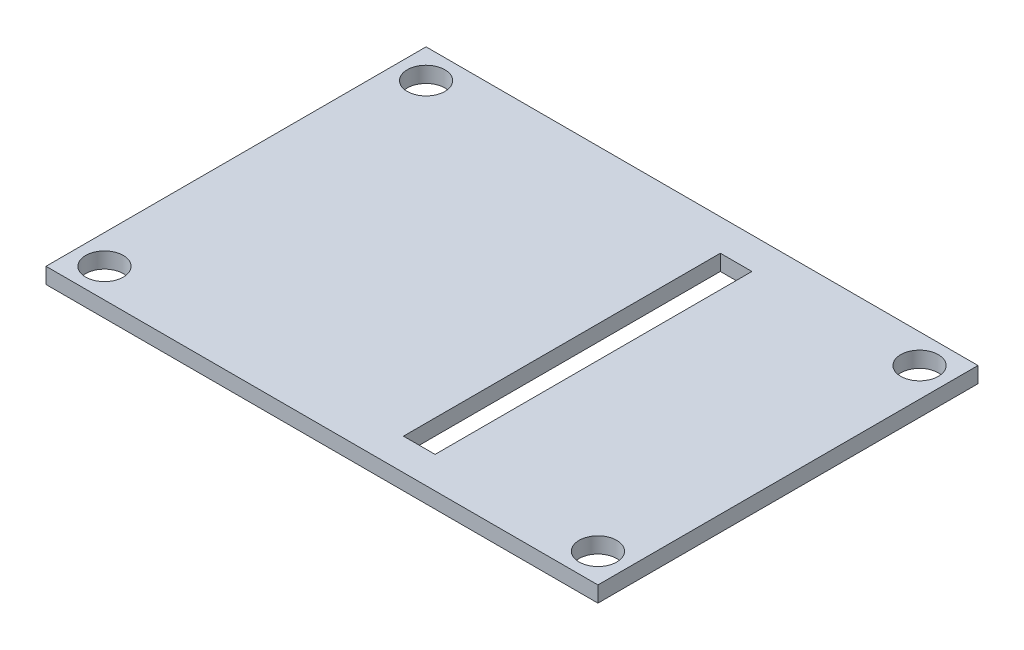
ISO-10303-21;
HEADER;
FILE_DESCRIPTION(('STEP AP214'),'2;1');
FILE_NAME('part.step','',(''),(''),'','','');
FILE_SCHEMA(('AUTOMOTIVE_DESIGN { 1 0 10303 214 1 1 1 1 }'));
ENDSEC;
DATA;
#1=APPLICATION_CONTEXT('core data for automotive mechanical design processes');
#2=APPLICATION_PROTOCOL_DEFINITION('international standard','automotive_design',2000,#1);
#3=PRODUCT_CONTEXT('',#1,'mechanical');
#4=PRODUCT('Part','Part','',(#3));
#5=PRODUCT_RELATED_PRODUCT_CATEGORY('part','',(#4));
#6=PRODUCT_DEFINITION_FORMATION('','',#4);
#7=PRODUCT_DEFINITION_CONTEXT('part definition',#1,'design');
#8=PRODUCT_DEFINITION('design','',#6,#7);
#9=PRODUCT_DEFINITION_SHAPE('','',#8);
#10=(LENGTH_UNIT() NAMED_UNIT(*) SI_UNIT(.MILLI.,.METRE.));
#11=(NAMED_UNIT(*) PLANE_ANGLE_UNIT() SI_UNIT($,.RADIAN.));
#12=(NAMED_UNIT(*) SI_UNIT($,.STERADIAN.) SOLID_ANGLE_UNIT());
#13=UNCERTAINTY_MEASURE_WITH_UNIT(LENGTH_MEASURE(1.E-05),#10,'distance_accuracy_value','');
#14=(GEOMETRIC_REPRESENTATION_CONTEXT(3) GLOBAL_UNCERTAINTY_ASSIGNED_CONTEXT((#13)) GLOBAL_UNIT_ASSIGNED_CONTEXT((#10,
#11,#12)) REPRESENTATION_CONTEXT('',''));
#15=CARTESIAN_POINT('',(0.,0.,0.));
#16=DIRECTION('',(0.,0.,1.));
#17=DIRECTION('',(1.,0.,0.));
#18=AXIS2_PLACEMENT_3D('',#15,#16,#17);
#19=CARTESIAN_POINT('',(0.,2.,0.));
#20=DIRECTION('',(0.,1.,0.));
#21=DIRECTION('',(0.,0.,1.));
#22=AXIS2_PLACEMENT_3D('',#19,#20,#21);
#23=PLANE('',#22);
#24=CARTESIAN_POINT('',(31.9666125815743,2.,-11.2942221147107));
#25=DIRECTION('',(0.,1.,0.));
#26=DIRECTION('',(0.,0.,1.));
#27=AXIS2_PLACEMENT_3D('',#24,#25,#26);
#28=CIRCLE('',#27,2.38125);
#29=CARTESIAN_POINT('',(31.9666125815743,2.,-8.91297211471072));
#30=VERTEX_POINT('',#29);
#31=EDGE_CURVE('E240',#30,#30,#28,.T.);
#32=ORIENTED_EDGE('',*,*,#31,.F.);
#33=EDGE_LOOP('',(#32));
#34=FACE_BOUND('',#33,.T.);
#35=CARTESIAN_POINT('',(31.9666125815743,2.,29.4057778852893));
#36=DIRECTION('',(0.,1.,0.));
#37=DIRECTION('',(0.,0.,1.));
#38=AXIS2_PLACEMENT_3D('',#35,#36,#37);
#39=CIRCLE('',#38,2.38125);
#40=CARTESIAN_POINT('',(31.9666125815743,2.,31.7870278852893));
#41=VERTEX_POINT('',#40);
#42=EDGE_CURVE('E242',#41,#41,#39,.T.);
#43=ORIENTED_EDGE('',*,*,#42,.F.);
#44=EDGE_LOOP('',(#43));
#45=FACE_BOUND('',#44,.T.);
#46=CARTESIAN_POINT('',(-30.4833874184257,2.,-11.2942221147107));
#47=DIRECTION('',(0.,1.,0.));
#48=DIRECTION('',(0.,0.,1.));
#49=AXIS2_PLACEMENT_3D('',#46,#47,#48);
#50=CIRCLE('',#49,2.38125);
#51=CARTESIAN_POINT('',(-30.4833874184257,2.,-8.91297211471072));
#52=VERTEX_POINT('',#51);
#53=EDGE_CURVE('E248',#52,#52,#50,.T.);
#54=ORIENTED_EDGE('',*,*,#53,.F.);
#55=EDGE_LOOP('',(#54));
#56=FACE_BOUND('',#55,.T.);
#57=CARTESIAN_POINT('',(-30.4833874184257,2.,29.4057778852893));
#58=DIRECTION('',(0.,1.,0.));
#59=DIRECTION('',(0.,0.,1.));
#60=AXIS2_PLACEMENT_3D('',#57,#58,#59);
#61=CIRCLE('',#60,2.38125);
#62=CARTESIAN_POINT('',(-30.4833874184257,2.,31.7870278852893));
#63=VERTEX_POINT('',#62);
#64=EDGE_CURVE('E254',#63,#63,#61,.T.);
#65=ORIENTED_EDGE('',*,*,#64,.F.);
#66=EDGE_LOOP('',(#65));
#67=FACE_BOUND('',#66,.T.);
#68=DIRECTION('',(0.,0.,1.));
#69=VECTOR('',#68,1.);
#70=CARTESIAN_POINT('',(-34.1833874184257,2.,-14.9942221147107));
#71=LINE('',#70,#69);
#72=CARTESIAN_POINT('',(-34.1833874184257,2.,-14.9942221147107));
#73=VERTEX_POINT('',#72);
#74=CARTESIAN_POINT('',(-34.1833874184257,2.,33.1057778852893));
#75=VERTEX_POINT('',#74);
#76=EDGE_CURVE('E138',#73,#75,#71,.T.);
#77=ORIENTED_EDGE('',*,*,#76,.T.);
#78=DIRECTION('',(1.,0.,0.));
#79=VECTOR('',#78,1.);
#80=CARTESIAN_POINT('',(-34.1833874184257,2.,33.1057778852893));
#81=LINE('',#80,#79);
#82=CARTESIAN_POINT('',(35.6666125815743,2.,33.1057778852893));
#83=VERTEX_POINT('',#82);
#84=EDGE_CURVE('E141',#75,#83,#81,.T.);
#85=ORIENTED_EDGE('',*,*,#84,.T.);
#86=DIRECTION('',(0.,0.,-1.));
#87=VECTOR('',#86,1.);
#88=CARTESIAN_POINT('',(35.6666125815743,2.,-14.9942221147107));
#89=LINE('',#88,#87);
#90=CARTESIAN_POINT('',(35.6666125815743,2.,-14.9942221147107));
#91=VERTEX_POINT('',#90);
#92=EDGE_CURVE('E144',#83,#91,#89,.T.);
#93=ORIENTED_EDGE('',*,*,#92,.T.);
#94=DIRECTION('',(-1.,0.,0.));
#95=VECTOR('',#94,1.);
#96=CARTESIAN_POINT('',(-34.1833874184257,2.,-14.9942221147107));
#97=LINE('',#96,#95);
#98=EDGE_CURVE('E146',#91,#73,#97,.T.);
#99=ORIENTED_EDGE('',*,*,#98,.T.);
#100=EDGE_LOOP('',(#77,#85,#93,#99));
#101=FACE_BOUND('',#100,.T.);
#102=DIRECTION('',(1.,0.,0.));
#103=VECTOR('',#102,1.);
#104=CARTESIAN_POINT('',(7.05661258157432,2.,29.1057778852893));
#105=LINE('',#104,#103);
#106=CARTESIAN_POINT('',(7.05661258157432,2.,29.1057778852893));
#107=VERTEX_POINT('',#106);
#108=CARTESIAN_POINT('',(11.0566125815743,2.,29.1057778852893));
#109=VERTEX_POINT('',#108);
#110=EDGE_CURVE('E108',#107,#109,#105,.T.);
#111=ORIENTED_EDGE('',*,*,#110,.F.);
#112=DIRECTION('',(0.,0.,1.));
#113=VECTOR('',#112,1.);
#114=CARTESIAN_POINT('',(7.05661258157431,2.,-10.9942221147107));
#115=LINE('',#114,#113);
#116=CARTESIAN_POINT('',(7.05661258157431,2.,-10.9942221147107));
#117=VERTEX_POINT('',#116);
#118=EDGE_CURVE('E100',#117,#107,#115,.T.);
#119=ORIENTED_EDGE('',*,*,#118,.F.);
#120=DIRECTION('',(-1.,0.,0.));
#121=VECTOR('',#120,1.);
#122=CARTESIAN_POINT('',(7.05661258157431,2.,-10.9942221147107));
#123=LINE('',#122,#121);
#124=CARTESIAN_POINT('',(11.0566125815743,2.,-10.9942221147107));
#125=VERTEX_POINT('',#124);
#126=EDGE_CURVE('E122',#125,#117,#123,.T.);
#127=ORIENTED_EDGE('',*,*,#126,.F.);
#128=DIRECTION('',(0.,0.,-1.));
#129=VECTOR('',#128,1.);
#130=CARTESIAN_POINT('',(11.0566125815743,2.,-10.9942221147107));
#131=LINE('',#130,#129);
#132=EDGE_CURVE('E120',#109,#125,#131,.T.);
#133=ORIENTED_EDGE('',*,*,#132,.F.);
#134=EDGE_LOOP('',(#111,#119,#127,#133));
#135=FACE_BOUND('',#134,.T.);
#136=ADVANCED_FACE('F35',(#34,#45,#56,#67,#101,#135),#23,.T.);
#137=CARTESIAN_POINT('',(0.,0.,0.));
#138=DIRECTION('',(0.,1.,0.));
#139=DIRECTION('',(0.,0.,1.));
#140=AXIS2_PLACEMENT_3D('',#137,#138,#139);
#141=PLANE('',#140);
#142=CARTESIAN_POINT('',(31.9666125815743,0.,-11.2942221147107));
#143=DIRECTION('',(0.,1.,0.));
#144=DIRECTION('',(0.,0.,1.));
#145=AXIS2_PLACEMENT_3D('',#142,#143,#144);
#146=CIRCLE('',#145,2.38125);
#147=CARTESIAN_POINT('',(31.9666125815743,0.,-8.91297211471072));
#148=VERTEX_POINT('',#147);
#149=EDGE_CURVE('E238',#148,#148,#146,.T.);
#150=ORIENTED_EDGE('',*,*,#149,.T.);
#151=EDGE_LOOP('',(#150));
#152=FACE_BOUND('',#151,.T.);
#153=CARTESIAN_POINT('',(31.9666125815743,0.,29.4057778852893));
#154=DIRECTION('',(0.,1.,0.));
#155=DIRECTION('',(0.,0.,1.));
#156=AXIS2_PLACEMENT_3D('',#153,#154,#155);
#157=CIRCLE('',#156,2.38125);
#158=CARTESIAN_POINT('',(31.9666125815743,0.,31.7870278852893));
#159=VERTEX_POINT('',#158);
#160=EDGE_CURVE('E245',#159,#159,#157,.T.);
#161=ORIENTED_EDGE('',*,*,#160,.T.);
#162=EDGE_LOOP('',(#161));
#163=FACE_BOUND('',#162,.T.);
#164=CARTESIAN_POINT('',(-30.4833874184257,0.,-11.2942221147107));
#165=DIRECTION('',(0.,1.,0.));
#166=DIRECTION('',(0.,0.,1.));
#167=AXIS2_PLACEMENT_3D('',#164,#165,#166);
#168=CIRCLE('',#167,2.38125);
#169=CARTESIAN_POINT('',(-30.4833874184257,0.,-8.91297211471072));
#170=VERTEX_POINT('',#169);
#171=EDGE_CURVE('E251',#170,#170,#168,.T.);
#172=ORIENTED_EDGE('',*,*,#171,.T.);
#173=EDGE_LOOP('',(#172));
#174=FACE_BOUND('',#173,.T.);
#175=CARTESIAN_POINT('',(-30.4833874184257,0.,29.4057778852893));
#176=DIRECTION('',(0.,1.,0.));
#177=DIRECTION('',(0.,0.,1.));
#178=AXIS2_PLACEMENT_3D('',#175,#176,#177);
#179=CIRCLE('',#178,2.38125);
#180=CARTESIAN_POINT('',(-30.4833874184257,0.,31.7870278852893));
#181=VERTEX_POINT('',#180);
#182=EDGE_CURVE('E128',#181,#181,#179,.T.);
#183=ORIENTED_EDGE('',*,*,#182,.T.);
#184=EDGE_LOOP('',(#183));
#185=FACE_BOUND('',#184,.T.);
#186=DIRECTION('',(0.,0.,1.));
#187=VECTOR('',#186,1.);
#188=CARTESIAN_POINT('',(-34.1833874184257,0.,-14.9942221147107));
#189=LINE('',#188,#187);
#190=CARTESIAN_POINT('',(-34.1833874184257,0.,-14.9942221147107));
#191=VERTEX_POINT('',#190);
#192=CARTESIAN_POINT('',(-34.1833874184257,0.,33.1057778852893));
#193=VERTEX_POINT('',#192);
#194=EDGE_CURVE('E116',#191,#193,#189,.T.);
#195=ORIENTED_EDGE('',*,*,#194,.F.);
#196=DIRECTION('',(-1.,0.,0.));
#197=VECTOR('',#196,1.);
#198=CARTESIAN_POINT('',(-34.1833874184257,0.,-14.9942221147107));
#199=LINE('',#198,#197);
#200=CARTESIAN_POINT('',(35.6666125815743,0.,-14.9942221147107));
#201=VERTEX_POINT('',#200);
#202=EDGE_CURVE('E142',#201,#191,#199,.T.);
#203=ORIENTED_EDGE('',*,*,#202,.F.);
#204=DIRECTION('',(0.,0.,-1.));
#205=VECTOR('',#204,1.);
#206=CARTESIAN_POINT('',(35.6666125815743,0.,-14.9942221147107));
#207=LINE('',#206,#205);
#208=CARTESIAN_POINT('',(35.6666125815743,0.,33.1057778852893));
#209=VERTEX_POINT('',#208);
#210=EDGE_CURVE('E153',#209,#201,#207,.T.);
#211=ORIENTED_EDGE('',*,*,#210,.F.);
#212=DIRECTION('',(1.,0.,0.));
#213=VECTOR('',#212,1.);
#214=CARTESIAN_POINT('',(-34.1833874184257,0.,33.1057778852893));
#215=LINE('',#214,#213);
#216=EDGE_CURVE('E151',#193,#209,#215,.T.);
#217=ORIENTED_EDGE('',*,*,#216,.F.);
#218=EDGE_LOOP('',(#195,#203,#211,#217));
#219=FACE_BOUND('',#218,.T.);
#220=DIRECTION('',(0.,0.,1.));
#221=VECTOR('',#220,1.);
#222=CARTESIAN_POINT('',(7.05661258157431,0.,-10.9942221147107));
#223=LINE('',#222,#221);
#224=CARTESIAN_POINT('',(7.05661258157431,0.,-10.9942221147107));
#225=VERTEX_POINT('',#224);
#226=CARTESIAN_POINT('',(7.05661258157432,0.,29.1057778852893));
#227=VERTEX_POINT('',#226);
#228=EDGE_CURVE('E58',#225,#227,#223,.T.);
#229=ORIENTED_EDGE('',*,*,#228,.T.);
#230=DIRECTION('',(1.,0.,0.));
#231=VECTOR('',#230,1.);
#232=CARTESIAN_POINT('',(7.05661258157432,0.,29.1057778852893));
#233=LINE('',#232,#231);
#234=CARTESIAN_POINT('',(11.0566125815743,0.,29.1057778852893));
#235=VERTEX_POINT('',#234);
#236=EDGE_CURVE('E115',#227,#235,#233,.T.);
#237=ORIENTED_EDGE('',*,*,#236,.T.);
#238=DIRECTION('',(0.,0.,-1.));
#239=VECTOR('',#238,1.);
#240=CARTESIAN_POINT('',(11.0566125815743,0.,-10.9942221147107));
#241=LINE('',#240,#239);
#242=CARTESIAN_POINT('',(11.0566125815743,0.,-10.9942221147107));
#243=VERTEX_POINT('',#242);
#244=EDGE_CURVE('E130',#235,#243,#241,.T.);
#245=ORIENTED_EDGE('',*,*,#244,.T.);
#246=DIRECTION('',(-1.,0.,0.));
#247=VECTOR('',#246,1.);
#248=CARTESIAN_POINT('',(7.05661258157431,0.,-10.9942221147107));
#249=LINE('',#248,#247);
#250=EDGE_CURVE('E109',#243,#225,#249,.T.);
#251=ORIENTED_EDGE('',*,*,#250,.T.);
#252=EDGE_LOOP('',(#229,#237,#245,#251));
#253=FACE_BOUND('',#252,.T.);
#254=ADVANCED_FACE('F171',(#152,#163,#174,#185,#219,#253),#141,.F.);
#255=CARTESIAN_POINT('',(-34.1833874184257,2.,-14.9942221147107));
#256=DIRECTION('',(1.,0.,0.));
#257=DIRECTION('',(0.,0.,-1.));
#258=AXIS2_PLACEMENT_3D('',#255,#256,#257);
#259=PLANE('',#258);
#260=ORIENTED_EDGE('',*,*,#194,.T.);
#261=DIRECTION('',(0.,-1.,0.));
#262=VECTOR('',#261,1.);
#263=CARTESIAN_POINT('',(-34.1833874184257,2.,33.1057778852893));
#264=LINE('',#263,#262);
#265=EDGE_CURVE('E11',#75,#193,#264,.T.);
#266=ORIENTED_EDGE('',*,*,#265,.F.);
#267=ORIENTED_EDGE('',*,*,#76,.F.);
#268=DIRECTION('',(0.,-1.,0.));
#269=VECTOR('',#268,1.);
#270=CARTESIAN_POINT('',(-34.1833874184257,2.,-14.9942221147107));
#271=LINE('',#270,#269);
#272=EDGE_CURVE('E148',#73,#191,#271,.T.);
#273=ORIENTED_EDGE('',*,*,#272,.T.);
#274=EDGE_LOOP('',(#260,#266,#267,#273));
#275=FACE_BOUND('',#274,.T.);
#276=ADVANCED_FACE('F37',(#275),#259,.F.);
#277=CARTESIAN_POINT('',(-34.1833874184257,2.,33.1057778852893));
#278=DIRECTION('',(0.,0.,-1.));
#279=DIRECTION('',(-1.,0.,0.));
#280=AXIS2_PLACEMENT_3D('',#277,#278,#279);
#281=PLANE('',#280);
#282=ORIENTED_EDGE('',*,*,#216,.T.);
#283=DIRECTION('',(0.,-1.,0.));
#284=VECTOR('',#283,1.);
#285=CARTESIAN_POINT('',(35.6666125815743,2.,33.1057778852893));
#286=LINE('',#285,#284);
#287=EDGE_CURVE('E43',#83,#209,#286,.T.);
#288=ORIENTED_EDGE('',*,*,#287,.F.);
#289=ORIENTED_EDGE('',*,*,#84,.F.);
#290=ORIENTED_EDGE('',*,*,#265,.T.);
#291=EDGE_LOOP('',(#282,#288,#289,#290));
#292=FACE_BOUND('',#291,.T.);
#293=ADVANCED_FACE('F181',(#292),#281,.F.);
#294=CARTESIAN_POINT('',(35.6666125815743,2.,-14.9942221147107));
#295=DIRECTION('',(-1.,0.,0.));
#296=DIRECTION('',(0.,0.,1.));
#297=AXIS2_PLACEMENT_3D('',#294,#295,#296);
#298=PLANE('',#297);
#299=ORIENTED_EDGE('',*,*,#210,.T.);
#300=DIRECTION('',(0.,-1.,0.));
#301=VECTOR('',#300,1.);
#302=CARTESIAN_POINT('',(35.6666125815743,2.,-14.9942221147107));
#303=LINE('',#302,#301);
#304=EDGE_CURVE('E158',#91,#201,#303,.T.);
#305=ORIENTED_EDGE('',*,*,#304,.F.);
#306=ORIENTED_EDGE('',*,*,#92,.F.);
#307=ORIENTED_EDGE('',*,*,#287,.T.);
#308=EDGE_LOOP('',(#299,#305,#306,#307));
#309=FACE_BOUND('',#308,.T.);
#310=ADVANCED_FACE('F165',(#309),#298,.F.);
#311=CARTESIAN_POINT('',(-34.1833874184257,2.,-14.9942221147107));
#312=DIRECTION('',(0.,0.,1.));
#313=DIRECTION('',(1.,0.,0.));
#314=AXIS2_PLACEMENT_3D('',#311,#312,#313);
#315=PLANE('',#314);
#316=ORIENTED_EDGE('',*,*,#202,.T.);
#317=ORIENTED_EDGE('',*,*,#272,.F.);
#318=ORIENTED_EDGE('',*,*,#98,.F.);
#319=ORIENTED_EDGE('',*,*,#304,.T.);
#320=EDGE_LOOP('',(#316,#317,#318,#319));
#321=FACE_BOUND('',#320,.T.);
#322=ADVANCED_FACE('F175',(#321),#315,.F.);
#323=CARTESIAN_POINT('',(7.05661258157431,2.,-10.9942221147107));
#324=DIRECTION('',(1.,0.,0.));
#325=DIRECTION('',(0.,0.,-1.));
#326=AXIS2_PLACEMENT_3D('',#323,#324,#325);
#327=PLANE('',#326);
#328=ORIENTED_EDGE('',*,*,#228,.F.);
#329=DIRECTION('',(0.,-1.,0.));
#330=VECTOR('',#329,1.);
#331=CARTESIAN_POINT('',(7.05661258157431,2.,-10.9942221147107));
#332=LINE('',#331,#330);
#333=EDGE_CURVE('E104',#117,#225,#332,.T.);
#334=ORIENTED_EDGE('',*,*,#333,.F.);
#335=ORIENTED_EDGE('',*,*,#118,.T.);
#336=DIRECTION('',(0.,-1.,0.));
#337=VECTOR('',#336,1.);
#338=CARTESIAN_POINT('',(7.05661258157432,2.,29.1057778852893));
#339=LINE('',#338,#337);
#340=EDGE_CURVE('E103',#107,#227,#339,.T.);
#341=ORIENTED_EDGE('',*,*,#340,.T.);
#342=EDGE_LOOP('',(#328,#334,#335,#341));
#343=FACE_BOUND('',#342,.T.);
#344=ADVANCED_FACE('F102',(#343),#327,.T.);
#345=CARTESIAN_POINT('',(7.05661258157432,2.,29.1057778852893));
#346=DIRECTION('',(0.,0.,-1.));
#347=DIRECTION('',(-1.,0.,0.));
#348=AXIS2_PLACEMENT_3D('',#345,#346,#347);
#349=PLANE('',#348);
#350=ORIENTED_EDGE('',*,*,#236,.F.);
#351=ORIENTED_EDGE('',*,*,#340,.F.);
#352=ORIENTED_EDGE('',*,*,#110,.T.);
#353=DIRECTION('',(0.,-1.,0.));
#354=VECTOR('',#353,1.);
#355=CARTESIAN_POINT('',(11.0566125815743,2.,29.1057778852893));
#356=LINE('',#355,#354);
#357=EDGE_CURVE('E117',#109,#235,#356,.T.);
#358=ORIENTED_EDGE('',*,*,#357,.T.);
#359=EDGE_LOOP('',(#350,#351,#352,#358));
#360=FACE_BOUND('',#359,.T.);
#361=ADVANCED_FACE('F112',(#360),#349,.T.);
#362=CARTESIAN_POINT('',(11.0566125815743,2.,-10.9942221147107));
#363=DIRECTION('',(-1.,0.,0.));
#364=DIRECTION('',(0.,0.,1.));
#365=AXIS2_PLACEMENT_3D('',#362,#363,#364);
#366=PLANE('',#365);
#367=ORIENTED_EDGE('',*,*,#244,.F.);
#368=ORIENTED_EDGE('',*,*,#357,.F.);
#369=ORIENTED_EDGE('',*,*,#132,.T.);
#370=DIRECTION('',(0.,-1.,0.));
#371=VECTOR('',#370,1.);
#372=CARTESIAN_POINT('',(11.0566125815743,2.,-10.9942221147107));
#373=LINE('',#372,#371);
#374=EDGE_CURVE('E50',#125,#243,#373,.T.);
#375=ORIENTED_EDGE('',*,*,#374,.T.);
#376=EDGE_LOOP('',(#367,#368,#369,#375));
#377=FACE_BOUND('',#376,.T.);
#378=ADVANCED_FACE('F208',(#377),#366,.T.);
#379=CARTESIAN_POINT('',(7.05661258157431,2.,-10.9942221147107));
#380=DIRECTION('',(0.,0.,1.));
#381=DIRECTION('',(1.,0.,0.));
#382=AXIS2_PLACEMENT_3D('',#379,#380,#381);
#383=PLANE('',#382);
#384=ORIENTED_EDGE('',*,*,#250,.F.);
#385=ORIENTED_EDGE('',*,*,#374,.F.);
#386=ORIENTED_EDGE('',*,*,#126,.T.);
#387=ORIENTED_EDGE('',*,*,#333,.T.);
#388=EDGE_LOOP('',(#384,#385,#386,#387));
#389=FACE_BOUND('',#388,.T.);
#390=ADVANCED_FACE('F212',(#389),#383,.T.);
#391=CARTESIAN_POINT('',(-30.4833874184257,0.,29.4057778852893));
#392=DIRECTION('',(0.,1.,0.));
#393=DIRECTION('',(0.,0.,1.));
#394=AXIS2_PLACEMENT_3D('',#391,#392,#393);
#395=CYLINDRICAL_SURFACE('',#394,2.38125);
#396=ORIENTED_EDGE('',*,*,#182,.F.);
#397=EDGE_LOOP('',(#396));
#398=FACE_BOUND('',#397,.T.);
#399=ORIENTED_EDGE('',*,*,#64,.T.);
#400=EDGE_LOOP('',(#399));
#401=FACE_BOUND('',#400,.T.);
#402=ADVANCED_FACE('F218',(#398,#401),#395,.F.);
#403=CARTESIAN_POINT('',(-30.4833874184257,0.,-11.2942221147107));
#404=DIRECTION('',(0.,1.,0.));
#405=DIRECTION('',(0.,0.,1.));
#406=AXIS2_PLACEMENT_3D('',#403,#404,#405);
#407=CYLINDRICAL_SURFACE('',#406,2.38125);
#408=ORIENTED_EDGE('',*,*,#171,.F.);
#409=EDGE_LOOP('',(#408));
#410=FACE_BOUND('',#409,.T.);
#411=ORIENTED_EDGE('',*,*,#53,.T.);
#412=EDGE_LOOP('',(#411));
#413=FACE_BOUND('',#412,.T.);
#414=ADVANCED_FACE('F221',(#410,#413),#407,.F.);
#415=CARTESIAN_POINT('',(31.9666125815743,0.,29.4057778852893));
#416=DIRECTION('',(0.,1.,0.));
#417=DIRECTION('',(0.,0.,1.));
#418=AXIS2_PLACEMENT_3D('',#415,#416,#417);
#419=CYLINDRICAL_SURFACE('',#418,2.38125);
#420=ORIENTED_EDGE('',*,*,#160,.F.);
#421=EDGE_LOOP('',(#420));
#422=FACE_BOUND('',#421,.T.);
#423=ORIENTED_EDGE('',*,*,#42,.T.);
#424=EDGE_LOOP('',(#423));
#425=FACE_BOUND('',#424,.T.);
#426=ADVANCED_FACE('F225',(#422,#425),#419,.F.);
#427=CARTESIAN_POINT('',(31.9666125815743,0.,-11.2942221147107));
#428=DIRECTION('',(0.,1.,0.));
#429=DIRECTION('',(0.,0.,1.));
#430=AXIS2_PLACEMENT_3D('',#427,#428,#429);
#431=CYLINDRICAL_SURFACE('',#430,2.38125);
#432=ORIENTED_EDGE('',*,*,#149,.F.);
#433=EDGE_LOOP('',(#432));
#434=FACE_BOUND('',#433,.T.);
#435=ORIENTED_EDGE('',*,*,#31,.T.);
#436=EDGE_LOOP('',(#435));
#437=FACE_BOUND('',#436,.T.);
#438=ADVANCED_FACE('F229',(#434,#437),#431,.F.);
#439=CLOSED_SHELL('',(#136,#254,#276,#293,#310,#322,#344,#361,#378,#390,#402,#414,#426,#438));
#440=MANIFOLD_SOLID_BREP('B2',#439);
#441=ADVANCED_BREP_SHAPE_REPRESENTATION('',(#18,#440),#14);
#442=SHAPE_DEFINITION_REPRESENTATION(#9,#441);
ENDSEC;
END-ISO-10303-21;
